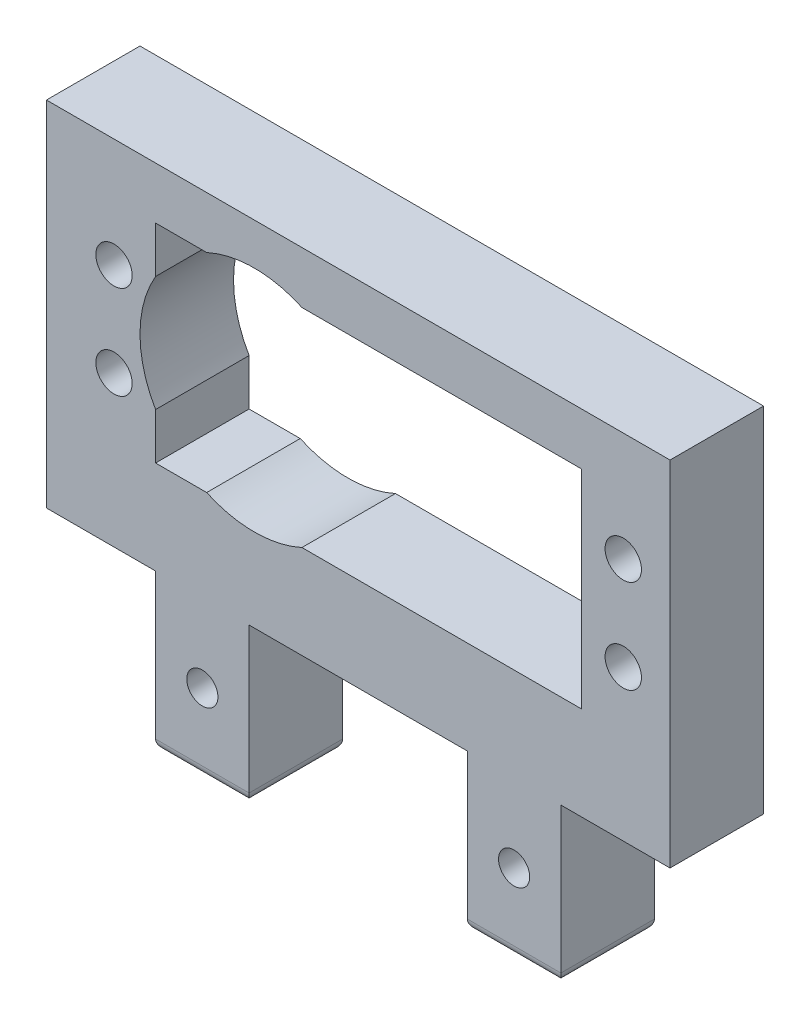
ISO-10303-21;
HEADER;
FILE_DESCRIPTION(('STEP AP214'),'2;1');
FILE_NAME('part.step','',(''),(''),'','','');
FILE_SCHEMA(('AUTOMOTIVE_DESIGN { 1 0 10303 214 1 1 1 1 }'));
ENDSEC;
DATA;
#1=APPLICATION_CONTEXT('core data for automotive mechanical design processes');
#2=APPLICATION_PROTOCOL_DEFINITION('international standard','automotive_design',2000,#1);
#3=PRODUCT_CONTEXT('',#1,'mechanical');
#4=PRODUCT('Part','Part','',(#3));
#5=PRODUCT_RELATED_PRODUCT_CATEGORY('part','',(#4));
#6=PRODUCT_DEFINITION_FORMATION('','',#4);
#7=PRODUCT_DEFINITION_CONTEXT('part definition',#1,'design');
#8=PRODUCT_DEFINITION('design','',#6,#7);
#9=PRODUCT_DEFINITION_SHAPE('','',#8);
#10=(LENGTH_UNIT() NAMED_UNIT(*) SI_UNIT(.MILLI.,.METRE.));
#11=(NAMED_UNIT(*) PLANE_ANGLE_UNIT() SI_UNIT($,.RADIAN.));
#12=(NAMED_UNIT(*) SI_UNIT($,.STERADIAN.) SOLID_ANGLE_UNIT());
#13=UNCERTAINTY_MEASURE_WITH_UNIT(LENGTH_MEASURE(1.E-05),#10,'distance_accuracy_value','');
#14=(GEOMETRIC_REPRESENTATION_CONTEXT(3) GLOBAL_UNCERTAINTY_ASSIGNED_CONTEXT((#13)) GLOBAL_UNIT_ASSIGNED_CONTEXT((#10,
#11,#12)) REPRESENTATION_CONTEXT('',''));
#15=CARTESIAN_POINT('',(0.,0.,0.));
#16=DIRECTION('',(0.,0.,1.));
#17=DIRECTION('',(1.,0.,0.));
#18=AXIS2_PLACEMENT_3D('',#15,#16,#17);
#19=CARTESIAN_POINT('',(0.,0.,9.));
#20=DIRECTION('',(0.,1.,0.));
#21=DIRECTION('',(0.,0.,1.));
#22=AXIS2_PLACEMENT_3D('',#19,#20,#21);
#23=PLANE('',#22);
#24=DIRECTION('',(1.,0.,0.));
#25=VECTOR('',#24,1.);
#26=CARTESIAN_POINT('',(0.,0.,0.));
#27=LINE('',#26,#25);
#28=CARTESIAN_POINT('',(0.,0.,0.));
#29=VERTEX_POINT('',#28);
#30=CARTESIAN_POINT('',(10.5,0.,0.));
#31=VERTEX_POINT('',#30);
#32=EDGE_CURVE('E329',#29,#31,#27,.T.);
#33=ORIENTED_EDGE('',*,*,#32,.T.);
#34=DIRECTION('',(0.,0.,-1.));
#35=VECTOR('',#34,1.);
#36=CARTESIAN_POINT('',(10.5,0.,9.));
#37=LINE('',#36,#35);
#38=CARTESIAN_POINT('',(10.5,0.,9.));
#39=VERTEX_POINT('',#38);
#40=EDGE_CURVE('E370',#39,#31,#37,.T.);
#41=ORIENTED_EDGE('',*,*,#40,.F.);
#42=DIRECTION('',(1.,0.,0.));
#43=VECTOR('',#42,1.);
#44=CARTESIAN_POINT('',(0.,0.,9.));
#45=LINE('',#44,#43);
#46=CARTESIAN_POINT('',(0.,0.,9.));
#47=VERTEX_POINT('',#46);
#48=EDGE_CURVE('E271',#47,#39,#45,.T.);
#49=ORIENTED_EDGE('',*,*,#48,.F.);
#50=DIRECTION('',(0.,0.,-1.));
#51=VECTOR('',#50,1.);
#52=CARTESIAN_POINT('',(0.,0.,9.));
#53=LINE('',#52,#51);
#54=EDGE_CURVE('E218',#47,#29,#53,.T.);
#55=ORIENTED_EDGE('',*,*,#54,.T.);
#56=EDGE_LOOP('',(#33,#41,#49,#55));
#57=FACE_BOUND('',#56,.T.);
#58=ADVANCED_FACE('F35',(#57),#23,.F.);
#59=CARTESIAN_POINT('',(10.5,0.,9.));
#60=DIRECTION('',(-1.,0.,0.));
#61=DIRECTION('',(0.,0.,1.));
#62=AXIS2_PLACEMENT_3D('',#59,#60,#61);
#63=PLANE('',#62);
#64=DIRECTION('',(0.,1.,0.));
#65=VECTOR('',#64,1.);
#66=CARTESIAN_POINT('',(10.5,0.,0.));
#67=LINE('',#66,#65);
#68=CARTESIAN_POINT('',(10.5,-14.,0.));
#69=VERTEX_POINT('',#68);
#70=EDGE_CURVE('E332',#69,#31,#67,.T.);
#71=ORIENTED_EDGE('',*,*,#70,.F.);
#72=DIRECTION('',(0.,0.,-1.));
#73=VECTOR('',#72,1.);
#74=CARTESIAN_POINT('',(10.5,-14.,9.));
#75=LINE('',#74,#73);
#76=CARTESIAN_POINT('',(10.5,-14.,9.));
#77=VERTEX_POINT('',#76);
#78=EDGE_CURVE('E44',#69,#77,#75,.F.);
#79=ORIENTED_EDGE('',*,*,#78,.T.);
#80=DIRECTION('',(0.,1.,0.));
#81=VECTOR('',#80,1.);
#82=CARTESIAN_POINT('',(10.5,0.,9.));
#83=LINE('',#82,#81);
#84=EDGE_CURVE('E274',#77,#39,#83,.T.);
#85=ORIENTED_EDGE('',*,*,#84,.T.);
#86=ORIENTED_EDGE('',*,*,#40,.T.);
#87=EDGE_LOOP('',(#71,#79,#85,#86));
#88=FACE_BOUND('',#87,.T.);
#89=ADVANCED_FACE('F486',(#88),#63,.T.);
#90=CARTESIAN_POINT('',(0.,-15.,9.));
#91=DIRECTION('',(0.,1.,0.));
#92=DIRECTION('',(0.,0.,1.));
#93=AXIS2_PLACEMENT_3D('',#90,#91,#92);
#94=PLANE('',#93);
#95=DIRECTION('',(1.,0.,0.));
#96=VECTOR('',#95,1.);
#97=CARTESIAN_POINT('',(10.5,-15.,8.));
#98=LINE('',#97,#96);
#99=CARTESIAN_POINT('',(18.5,-15.,8.));
#100=VERTEX_POINT('',#99);
#101=CARTESIAN_POINT('',(11.5,-15.,8.));
#102=VERTEX_POINT('',#101);
#103=EDGE_CURVE('E52',#100,#102,#98,.F.);
#104=ORIENTED_EDGE('',*,*,#103,.T.);
#105=DIRECTION('',(0.,0.,-1.));
#106=VECTOR('',#105,1.);
#107=CARTESIAN_POINT('',(11.5,-15.,0.));
#108=LINE('',#107,#106);
#109=CARTESIAN_POINT('',(11.5,-15.,0.999999999999999));
#110=VERTEX_POINT('',#109);
#111=EDGE_CURVE('E415',#102,#110,#108,.T.);
#112=ORIENTED_EDGE('',*,*,#111,.T.);
#113=DIRECTION('',(1.,0.,0.));
#114=VECTOR('',#113,1.);
#115=CARTESIAN_POINT('',(0.,-15.,0.999999999999999));
#116=LINE('',#115,#114);
#117=CARTESIAN_POINT('',(18.5,-15.,0.999999999999999));
#118=VERTEX_POINT('',#117);
#119=EDGE_CURVE('E411',#110,#118,#116,.T.);
#120=ORIENTED_EDGE('',*,*,#119,.T.);
#121=DIRECTION('',(0.,0.,-1.));
#122=VECTOR('',#121,1.);
#123=CARTESIAN_POINT('',(18.5,-15.,9.));
#124=LINE('',#123,#122);
#125=EDGE_CURVE('E57',#118,#100,#124,.F.);
#126=ORIENTED_EDGE('',*,*,#125,.T.);
#127=EDGE_LOOP('',(#104,#112,#120,#126));
#128=FACE_BOUND('',#127,.T.);
#129=ADVANCED_FACE('F493',(#128),#94,.F.);
#130=CARTESIAN_POINT('',(19.5,0.,9.));
#131=DIRECTION('',(-1.,0.,0.));
#132=DIRECTION('',(0.,-1.,0.));
#133=AXIS2_PLACEMENT_3D('',#130,#131,#132);
#134=PLANE('',#133);
#135=DIRECTION('',(0.,1.,0.));
#136=VECTOR('',#135,1.);
#137=CARTESIAN_POINT('',(19.5,0.,9.));
#138=LINE('',#137,#136);
#139=CARTESIAN_POINT('',(19.5,-14.,9.));
#140=VERTEX_POINT('',#139);
#141=CARTESIAN_POINT('',(19.5,0.,9.));
#142=VERTEX_POINT('',#141);
#143=EDGE_CURVE('E278',#140,#142,#138,.T.);
#144=ORIENTED_EDGE('',*,*,#143,.F.);
#145=DIRECTION('',(0.,0.,-1.));
#146=VECTOR('',#145,1.);
#147=CARTESIAN_POINT('',(19.5,-14.,9.));
#148=LINE('',#147,#146);
#149=CARTESIAN_POINT('',(19.5,-14.,0.));
#150=VERTEX_POINT('',#149);
#151=EDGE_CURVE('E11',#140,#150,#148,.T.);
#152=ORIENTED_EDGE('',*,*,#151,.T.);
#153=DIRECTION('',(0.,1.,0.));
#154=VECTOR('',#153,1.);
#155=CARTESIAN_POINT('',(19.5,0.,0.));
#156=LINE('',#155,#154);
#157=CARTESIAN_POINT('',(19.5,0.,0.));
#158=VERTEX_POINT('',#157);
#159=EDGE_CURVE('E336',#150,#158,#156,.T.);
#160=ORIENTED_EDGE('',*,*,#159,.T.);
#161=DIRECTION('',(0.,0.,-1.));
#162=VECTOR('',#161,1.);
#163=CARTESIAN_POINT('',(19.5,0.,9.));
#164=LINE('',#163,#162);
#165=EDGE_CURVE('E367',#142,#158,#164,.T.);
#166=ORIENTED_EDGE('',*,*,#165,.F.);
#167=EDGE_LOOP('',(#144,#152,#160,#166));
#168=FACE_BOUND('',#167,.T.);
#169=ADVANCED_FACE('F446',(#168),#134,.F.);
#170=CARTESIAN_POINT('',(40.5,0.,0.));
#171=VERTEX_POINT('',#170);
#172=EDGE_CURVE('E334',#158,#171,#27,.T.);
#173=ORIENTED_EDGE('',*,*,#172,.T.);
#174=DIRECTION('',(0.,0.,-1.));
#175=VECTOR('',#174,1.);
#176=CARTESIAN_POINT('',(40.5,0.,9.));
#177=LINE('',#176,#175);
#178=CARTESIAN_POINT('',(40.5,0.,9.));
#179=VERTEX_POINT('',#178);
#180=EDGE_CURVE('E364',#179,#171,#177,.T.);
#181=ORIENTED_EDGE('',*,*,#180,.F.);
#182=EDGE_CURVE('E276',#142,#179,#45,.T.);
#183=ORIENTED_EDGE('',*,*,#182,.F.);
#184=ORIENTED_EDGE('',*,*,#165,.T.);
#185=EDGE_LOOP('',(#173,#181,#183,#184));
#186=FACE_BOUND('',#185,.T.);
#187=ADVANCED_FACE('F500',(#186),#23,.F.);
#188=CARTESIAN_POINT('',(40.5,0.,9.));
#189=DIRECTION('',(-1.,0.,0.));
#190=DIRECTION('',(0.,-1.,0.));
#191=AXIS2_PLACEMENT_3D('',#188,#189,#190);
#192=PLANE('',#191);
#193=DIRECTION('',(0.,1.,0.));
#194=VECTOR('',#193,1.);
#195=CARTESIAN_POINT('',(40.5,0.,0.));
#196=LINE('',#195,#194);
#197=CARTESIAN_POINT('',(40.5,-14.,0.));
#198=VERTEX_POINT('',#197);
#199=EDGE_CURVE('E338',#198,#171,#196,.T.);
#200=ORIENTED_EDGE('',*,*,#199,.F.);
#201=DIRECTION('',(0.,0.,-1.));
#202=VECTOR('',#201,1.);
#203=CARTESIAN_POINT('',(40.5,-14.,9.));
#204=LINE('',#203,#202);
#205=CARTESIAN_POINT('',(40.5,-14.,9.));
#206=VERTEX_POINT('',#205);
#207=EDGE_CURVE('E398',#198,#206,#204,.F.);
#208=ORIENTED_EDGE('',*,*,#207,.T.);
#209=DIRECTION('',(0.,1.,0.));
#210=VECTOR('',#209,1.);
#211=CARTESIAN_POINT('',(40.5,0.,9.));
#212=LINE('',#211,#210);
#213=EDGE_CURVE('E280',#206,#179,#212,.T.);
#214=ORIENTED_EDGE('',*,*,#213,.T.);
#215=ORIENTED_EDGE('',*,*,#180,.T.);
#216=EDGE_LOOP('',(#200,#208,#214,#215));
#217=FACE_BOUND('',#216,.T.);
#218=ADVANCED_FACE('F510',(#217),#192,.T.);
#219=CARTESIAN_POINT('',(0.,-15.,9.));
#220=DIRECTION('',(0.,-1.,0.));
#221=DIRECTION('',(1.,0.,0.));
#222=AXIS2_PLACEMENT_3D('',#219,#220,#221);
#223=PLANE('',#222);
#224=DIRECTION('',(-1.,0.,0.));
#225=VECTOR('',#224,1.);
#226=CARTESIAN_POINT('',(0.,-15.,8.));
#227=LINE('',#226,#225);
#228=CARTESIAN_POINT('',(48.5,-15.,8.));
#229=VERTEX_POINT('',#228);
#230=CARTESIAN_POINT('',(41.5,-15.,8.));
#231=VERTEX_POINT('',#230);
#232=EDGE_CURVE('E393',#229,#231,#227,.T.);
#233=ORIENTED_EDGE('',*,*,#232,.T.);
#234=DIRECTION('',(0.,0.,-1.));
#235=VECTOR('',#234,1.);
#236=CARTESIAN_POINT('',(41.5,-15.,9.));
#237=LINE('',#236,#235);
#238=CARTESIAN_POINT('',(41.5,-15.,1.));
#239=VERTEX_POINT('',#238);
#240=EDGE_CURVE('E395',#231,#239,#237,.T.);
#241=ORIENTED_EDGE('',*,*,#240,.T.);
#242=DIRECTION('',(-1.,0.,0.));
#243=VECTOR('',#242,1.);
#244=CARTESIAN_POINT('',(49.5,-15.,1.));
#245=LINE('',#244,#243);
#246=CARTESIAN_POINT('',(48.5,-15.,1.));
#247=VERTEX_POINT('',#246);
#248=EDGE_CURVE('E373',#239,#247,#245,.F.);
#249=ORIENTED_EDGE('',*,*,#248,.T.);
#250=DIRECTION('',(0.,0.,-1.));
#251=VECTOR('',#250,1.);
#252=CARTESIAN_POINT('',(48.5,-15.,9.));
#253=LINE('',#252,#251);
#254=EDGE_CURVE('E391',#247,#229,#253,.F.);
#255=ORIENTED_EDGE('',*,*,#254,.T.);
#256=EDGE_LOOP('',(#233,#241,#249,#255));
#257=FACE_BOUND('',#256,.T.);
#258=ADVANCED_FACE('F517',(#257),#223,.T.);
#259=CARTESIAN_POINT('',(49.5,0.,9.));
#260=DIRECTION('',(-1.,0.,0.));
#261=DIRECTION('',(0.,0.,1.));
#262=AXIS2_PLACEMENT_3D('',#259,#260,#261);
#263=PLANE('',#262);
#264=DIRECTION('',(0.,1.,0.));
#265=VECTOR('',#264,1.);
#266=CARTESIAN_POINT('',(49.5,0.,9.));
#267=LINE('',#266,#265);
#268=CARTESIAN_POINT('',(49.5,-14.,9.));
#269=VERTEX_POINT('',#268);
#270=CARTESIAN_POINT('',(49.5,0.,9.));
#271=VERTEX_POINT('',#270);
#272=EDGE_CURVE('E282',#269,#271,#267,.T.);
#273=ORIENTED_EDGE('',*,*,#272,.F.);
#274=DIRECTION('',(0.,0.,-1.));
#275=VECTOR('',#274,1.);
#276=CARTESIAN_POINT('',(49.5,-14.,0.));
#277=LINE('',#276,#275);
#278=CARTESIAN_POINT('',(49.5,-14.,0.));
#279=VERTEX_POINT('',#278);
#280=EDGE_CURVE('E405',#269,#279,#277,.T.);
#281=ORIENTED_EDGE('',*,*,#280,.T.);
#282=DIRECTION('',(0.,1.,0.));
#283=VECTOR('',#282,1.);
#284=CARTESIAN_POINT('',(49.5,0.,0.));
#285=LINE('',#284,#283);
#286=CARTESIAN_POINT('',(49.5,0.,0.));
#287=VERTEX_POINT('',#286);
#288=EDGE_CURVE('E340',#279,#287,#285,.T.);
#289=ORIENTED_EDGE('',*,*,#288,.T.);
#290=DIRECTION('',(0.,0.,-1.));
#291=VECTOR('',#290,1.);
#292=CARTESIAN_POINT('',(49.5,0.,9.));
#293=LINE('',#292,#291);
#294=EDGE_CURVE('E361',#271,#287,#293,.T.);
#295=ORIENTED_EDGE('',*,*,#294,.F.);
#296=EDGE_LOOP('',(#273,#281,#289,#295));
#297=FACE_BOUND('',#296,.T.);
#298=ADVANCED_FACE('F512',(#297),#263,.F.);
#299=CARTESIAN_POINT('',(60.,0.,0.));
#300=VERTEX_POINT('',#299);
#301=EDGE_CURVE('E333',#287,#300,#27,.T.);
#302=ORIENTED_EDGE('',*,*,#301,.T.);
#303=DIRECTION('',(0.,0.,-1.));
#304=VECTOR('',#303,1.);
#305=CARTESIAN_POINT('',(60.,0.,9.));
#306=LINE('',#305,#304);
#307=CARTESIAN_POINT('',(60.,0.,9.));
#308=VERTEX_POINT('',#307);
#309=EDGE_CURVE('E358',#308,#300,#306,.T.);
#310=ORIENTED_EDGE('',*,*,#309,.F.);
#311=EDGE_CURVE('E275',#271,#308,#45,.T.);
#312=ORIENTED_EDGE('',*,*,#311,.F.);
#313=ORIENTED_EDGE('',*,*,#294,.T.);
#314=EDGE_LOOP('',(#302,#310,#312,#313));
#315=FACE_BOUND('',#314,.T.);
#316=ADVANCED_FACE('F461',(#315),#23,.F.);
#317=CARTESIAN_POINT('',(60.,0.,9.));
#318=DIRECTION('',(-1.,0.,0.));
#319=DIRECTION('',(0.,0.,1.));
#320=AXIS2_PLACEMENT_3D('',#317,#318,#319);
#321=PLANE('',#320);
#322=DIRECTION('',(0.,1.,0.));
#323=VECTOR('',#322,1.);
#324=CARTESIAN_POINT('',(60.,0.,0.));
#325=LINE('',#324,#323);
#326=CARTESIAN_POINT('',(60.,34.,0.));
#327=VERTEX_POINT('',#326);
#328=EDGE_CURVE('E342',#300,#327,#325,.T.);
#329=ORIENTED_EDGE('',*,*,#328,.T.);
#330=DIRECTION('',(0.,0.,-1.));
#331=VECTOR('',#330,1.);
#332=CARTESIAN_POINT('',(60.,34.,9.));
#333=LINE('',#332,#331);
#334=CARTESIAN_POINT('',(60.,34.,9.));
#335=VERTEX_POINT('',#334);
#336=EDGE_CURVE('E356',#335,#327,#333,.T.);
#337=ORIENTED_EDGE('',*,*,#336,.F.);
#338=DIRECTION('',(0.,1.,0.));
#339=VECTOR('',#338,1.);
#340=CARTESIAN_POINT('',(60.,0.,9.));
#341=LINE('',#340,#339);
#342=EDGE_CURVE('E284',#308,#335,#341,.T.);
#343=ORIENTED_EDGE('',*,*,#342,.F.);
#344=ORIENTED_EDGE('',*,*,#309,.T.);
#345=EDGE_LOOP('',(#329,#337,#343,#344));
#346=FACE_BOUND('',#345,.T.);
#347=ADVANCED_FACE('F467',(#346),#321,.F.);
#348=CARTESIAN_POINT('',(0.,34.,9.));
#349=DIRECTION('',(0.,1.,0.));
#350=DIRECTION('',(0.,0.,1.));
#351=AXIS2_PLACEMENT_3D('',#348,#349,#350);
#352=PLANE('',#351);
#353=DIRECTION('',(1.,0.,0.));
#354=VECTOR('',#353,1.);
#355=CARTESIAN_POINT('',(0.,34.,0.));
#356=LINE('',#355,#354);
#357=CARTESIAN_POINT('',(0.,34.,0.));
#358=VERTEX_POINT('',#357);
#359=EDGE_CURVE('E345',#358,#327,#356,.T.);
#360=ORIENTED_EDGE('',*,*,#359,.F.);
#361=DIRECTION('',(0.,0.,-1.));
#362=VECTOR('',#361,1.);
#363=CARTESIAN_POINT('',(0.,34.,9.));
#364=LINE('',#363,#362);
#365=CARTESIAN_POINT('',(0.,34.,9.));
#366=VERTEX_POINT('',#365);
#367=EDGE_CURVE('E354',#366,#358,#364,.T.);
#368=ORIENTED_EDGE('',*,*,#367,.F.);
#369=DIRECTION('',(1.,0.,0.));
#370=VECTOR('',#369,1.);
#371=CARTESIAN_POINT('',(0.,34.,9.));
#372=LINE('',#371,#370);
#373=EDGE_CURVE('E286',#366,#335,#372,.T.);
#374=ORIENTED_EDGE('',*,*,#373,.T.);
#375=ORIENTED_EDGE('',*,*,#336,.T.);
#376=EDGE_LOOP('',(#360,#368,#374,#375));
#377=FACE_BOUND('',#376,.T.);
#378=ADVANCED_FACE('F473',(#377),#352,.T.);
#379=CARTESIAN_POINT('',(20.,19.,9.));
#380=DIRECTION('',(0.,0.,-1.));
#381=DIRECTION('',(-1.,0.,0.));
#382=AXIS2_PLACEMENT_3D('',#379,#380,#381);
#383=CYLINDRICAL_SURFACE('',#382,11.);
#384=CARTESIAN_POINT('',(20.,19.,0.));
#385=DIRECTION('',(0.,0.,1.));
#386=DIRECTION('',(1.,0.,0.));
#387=AXIS2_PLACEMENT_3D('',#384,#385,#386);
#388=CIRCLE('',#387,11.);
#389=CARTESIAN_POINT('',(24.5825756949558,29.,0.));
#390=VERTEX_POINT('',#389);
#391=CARTESIAN_POINT('',(15.4174243050442,29.,0.));
#392=VERTEX_POINT('',#391);
#393=EDGE_CURVE('E215',#390,#392,#388,.T.);
#394=ORIENTED_EDGE('',*,*,#393,.F.);
#395=DIRECTION('',(0.,0.,-1.));
#396=VECTOR('',#395,1.);
#397=CARTESIAN_POINT('',(24.5825756949558,29.,9.));
#398=LINE('',#397,#396);
#399=CARTESIAN_POINT('',(24.5825756949558,29.,9.));
#400=VERTEX_POINT('',#399);
#401=EDGE_CURVE('E209',#400,#390,#398,.T.);
#402=ORIENTED_EDGE('',*,*,#401,.F.);
#403=CARTESIAN_POINT('',(20.,19.,9.));
#404=DIRECTION('',(0.,0.,1.));
#405=DIRECTION('',(1.,0.,0.));
#406=AXIS2_PLACEMENT_3D('',#403,#404,#405);
#407=CIRCLE('',#406,11.);
#408=CARTESIAN_POINT('',(15.4174243050442,29.,9.));
#409=VERTEX_POINT('',#408);
#410=EDGE_CURVE('E213',#400,#409,#407,.T.);
#411=ORIENTED_EDGE('',*,*,#410,.T.);
#412=DIRECTION('',(0.,0.,-1.));
#413=VECTOR('',#412,1.);
#414=CARTESIAN_POINT('',(15.4174243050442,29.,9.));
#415=LINE('',#414,#413);
#416=EDGE_CURVE('E298',#409,#392,#415,.T.);
#417=ORIENTED_EDGE('',*,*,#416,.T.);
#418=EDGE_LOOP('',(#394,#402,#411,#417));
#419=FACE_BOUND('',#418,.T.);
#420=ADVANCED_FACE('F211',(#419),#383,.F.);
#421=CARTESIAN_POINT('',(0.,29.,9.));
#422=DIRECTION('',(0.,1.,0.));
#423=DIRECTION('',(0.,0.,1.));
#424=AXIS2_PLACEMENT_3D('',#421,#422,#423);
#425=PLANE('',#424);
#426=DIRECTION('',(1.,0.,0.));
#427=VECTOR('',#426,1.);
#428=CARTESIAN_POINT('',(0.,29.,0.));
#429=LINE('',#428,#427);
#430=CARTESIAN_POINT('',(51.5,29.,0.));
#431=VERTEX_POINT('',#430);
#432=EDGE_CURVE('E300',#390,#431,#429,.T.);
#433=ORIENTED_EDGE('',*,*,#432,.T.);
#434=DIRECTION('',(0.,0.,-1.));
#435=VECTOR('',#434,1.);
#436=CARTESIAN_POINT('',(51.5,29.,9.));
#437=LINE('',#436,#435);
#438=CARTESIAN_POINT('',(51.5,29.,9.));
#439=VERTEX_POINT('',#438);
#440=EDGE_CURVE('E219',#439,#431,#437,.T.);
#441=ORIENTED_EDGE('',*,*,#440,.F.);
#442=DIRECTION('',(1.,0.,0.));
#443=VECTOR('',#442,1.);
#444=CARTESIAN_POINT('',(0.,29.,9.));
#445=LINE('',#444,#443);
#446=EDGE_CURVE('E222',#400,#439,#445,.T.);
#447=ORIENTED_EDGE('',*,*,#446,.F.);
#448=ORIENTED_EDGE('',*,*,#401,.T.);
#449=EDGE_LOOP('',(#433,#441,#447,#448));
#450=FACE_BOUND('',#449,.T.);
#451=ADVANCED_FACE('F223',(#450),#425,.F.);
#452=CARTESIAN_POINT('',(51.5,0.,9.));
#453=DIRECTION('',(1.,0.,0.));
#454=DIRECTION('',(0.,1.,0.));
#455=AXIS2_PLACEMENT_3D('',#452,#453,#454);
#456=PLANE('',#455);
#457=DIRECTION('',(0.,-1.,0.));
#458=VECTOR('',#457,1.);
#459=CARTESIAN_POINT('',(51.5,0.,0.));
#460=LINE('',#459,#458);
#461=CARTESIAN_POINT('',(51.5,9.,0.));
#462=VERTEX_POINT('',#461);
#463=EDGE_CURVE('E305',#431,#462,#460,.T.);
#464=ORIENTED_EDGE('',*,*,#463,.T.);
#465=DIRECTION('',(0.,0.,-1.));
#466=VECTOR('',#465,1.);
#467=CARTESIAN_POINT('',(51.5,9.,9.));
#468=LINE('',#467,#466);
#469=CARTESIAN_POINT('',(51.5,9.,9.));
#470=VERTEX_POINT('',#469);
#471=EDGE_CURVE('E387',#470,#462,#468,.T.);
#472=ORIENTED_EDGE('',*,*,#471,.F.);
#473=DIRECTION('',(0.,-1.,0.));
#474=VECTOR('',#473,1.);
#475=CARTESIAN_POINT('',(51.5,0.,9.));
#476=LINE('',#475,#474);
#477=EDGE_CURVE('E227',#439,#470,#476,.T.);
#478=ORIENTED_EDGE('',*,*,#477,.F.);
#479=ORIENTED_EDGE('',*,*,#440,.T.);
#480=EDGE_LOOP('',(#464,#472,#478,#479));
#481=FACE_BOUND('',#480,.T.);
#482=ADVANCED_FACE('F577',(#481),#456,.F.);
#483=CARTESIAN_POINT('',(0.,9.,9.));
#484=DIRECTION('',(0.,1.,0.));
#485=DIRECTION('',(0.,0.,1.));
#486=AXIS2_PLACEMENT_3D('',#483,#484,#485);
#487=PLANE('',#486);
#488=DIRECTION('',(1.,0.,0.));
#489=VECTOR('',#488,1.);
#490=CARTESIAN_POINT('',(0.,9.,0.));
#491=LINE('',#490,#489);
#492=CARTESIAN_POINT('',(24.5825756949558,9.,0.));
#493=VERTEX_POINT('',#492);
#494=EDGE_CURVE('E309',#493,#462,#491,.T.);
#495=ORIENTED_EDGE('',*,*,#494,.F.);
#496=DIRECTION('',(0.,0.,-1.));
#497=VECTOR('',#496,1.);
#498=CARTESIAN_POINT('',(24.5825756949558,9.,9.));
#499=LINE('',#498,#497);
#500=CARTESIAN_POINT('',(24.5825756949558,9.,9.));
#501=VERTEX_POINT('',#500);
#502=EDGE_CURVE('E385',#501,#493,#499,.T.);
#503=ORIENTED_EDGE('',*,*,#502,.F.);
#504=DIRECTION('',(1.,0.,0.));
#505=VECTOR('',#504,1.);
#506=CARTESIAN_POINT('',(0.,9.,9.));
#507=LINE('',#506,#505);
#508=EDGE_CURVE('E247',#501,#470,#507,.T.);
#509=ORIENTED_EDGE('',*,*,#508,.T.);
#510=ORIENTED_EDGE('',*,*,#471,.T.);
#511=EDGE_LOOP('',(#495,#503,#509,#510));
#512=FACE_BOUND('',#511,.T.);
#513=ADVANCED_FACE('F580',(#512),#487,.T.);
#514=CARTESIAN_POINT('',(15.4174243050442,9.,0.));
#515=VERTEX_POINT('',#514);
#516=EDGE_CURVE('E303',#515,#493,#388,.T.);
#517=ORIENTED_EDGE('',*,*,#516,.F.);
#518=DIRECTION('',(0.,0.,-1.));
#519=VECTOR('',#518,1.);
#520=CARTESIAN_POINT('',(15.4174243050442,9.,9.));
#521=LINE('',#520,#519);
#522=CARTESIAN_POINT('',(15.4174243050442,9.,9.));
#523=VERTEX_POINT('',#522);
#524=EDGE_CURVE('E383',#523,#515,#521,.T.);
#525=ORIENTED_EDGE('',*,*,#524,.F.);
#526=EDGE_CURVE('E238',#523,#501,#407,.T.);
#527=ORIENTED_EDGE('',*,*,#526,.T.);
#528=ORIENTED_EDGE('',*,*,#502,.T.);
#529=EDGE_LOOP('',(#517,#525,#527,#528));
#530=FACE_BOUND('',#529,.T.);
#531=ADVANCED_FACE('F586',(#530),#383,.F.);
#532=CARTESIAN_POINT('',(10.5,9.,0.));
#533=VERTEX_POINT('',#532);
#534=EDGE_CURVE('E312',#533,#515,#491,.T.);
#535=ORIENTED_EDGE('',*,*,#534,.F.);
#536=DIRECTION('',(0.,0.,-1.));
#537=VECTOR('',#536,1.);
#538=CARTESIAN_POINT('',(10.5,9.,9.));
#539=LINE('',#538,#537);
#540=CARTESIAN_POINT('',(10.5,9.,9.));
#541=VERTEX_POINT('',#540);
#542=EDGE_CURVE('E381',#541,#533,#539,.T.);
#543=ORIENTED_EDGE('',*,*,#542,.F.);
#544=EDGE_CURVE('E246',#541,#523,#507,.T.);
#545=ORIENTED_EDGE('',*,*,#544,.T.);
#546=ORIENTED_EDGE('',*,*,#524,.T.);
#547=EDGE_LOOP('',(#535,#543,#545,#546));
#548=FACE_BOUND('',#547,.T.);
#549=ADVANCED_FACE('F582',(#548),#487,.T.);
#550=CARTESIAN_POINT('',(10.5,0.,9.));
#551=DIRECTION('',(1.,0.,0.));
#552=DIRECTION('',(0.,1.,0.));
#553=AXIS2_PLACEMENT_3D('',#550,#551,#552);
#554=PLANE('',#553);
#555=DIRECTION('',(0.,-1.,0.));
#556=VECTOR('',#555,1.);
#557=CARTESIAN_POINT('',(10.5,0.,0.));
#558=LINE('',#557,#556);
#559=CARTESIAN_POINT('',(10.5,13.4547317467953,0.));
#560=VERTEX_POINT('',#559);
#561=EDGE_CURVE('E313',#560,#533,#558,.T.);
#562=ORIENTED_EDGE('',*,*,#561,.F.);
#563=DIRECTION('',(0.,0.,-1.));
#564=VECTOR('',#563,1.);
#565=CARTESIAN_POINT('',(10.5,13.4547317467953,9.));
#566=LINE('',#565,#564);
#567=CARTESIAN_POINT('',(10.5,13.4547317467953,9.));
#568=VERTEX_POINT('',#567);
#569=EDGE_CURVE('E379',#568,#560,#566,.T.);
#570=ORIENTED_EDGE('',*,*,#569,.F.);
#571=DIRECTION('',(0.,-1.,0.));
#572=VECTOR('',#571,1.);
#573=CARTESIAN_POINT('',(10.5,0.,9.));
#574=LINE('',#573,#572);
#575=EDGE_CURVE('E244',#568,#541,#574,.T.);
#576=ORIENTED_EDGE('',*,*,#575,.T.);
#577=ORIENTED_EDGE('',*,*,#542,.T.);
#578=EDGE_LOOP('',(#562,#570,#576,#577));
#579=FACE_BOUND('',#578,.T.);
#580=ADVANCED_FACE('F585',(#579),#554,.T.);
#581=CARTESIAN_POINT('',(10.5,24.5452682532047,0.));
#582=VERTEX_POINT('',#581);
#583=EDGE_CURVE('E302',#582,#560,#388,.T.);
#584=ORIENTED_EDGE('',*,*,#583,.F.);
#585=DIRECTION('',(0.,0.,-1.));
#586=VECTOR('',#585,1.);
#587=CARTESIAN_POINT('',(10.5,24.5452682532047,9.));
#588=LINE('',#587,#586);
#589=CARTESIAN_POINT('',(10.5,24.5452682532047,9.));
#590=VERTEX_POINT('',#589);
#591=EDGE_CURVE('E377',#590,#582,#588,.T.);
#592=ORIENTED_EDGE('',*,*,#591,.F.);
#593=EDGE_CURVE('E237',#590,#568,#407,.T.);
#594=ORIENTED_EDGE('',*,*,#593,.T.);
#595=ORIENTED_EDGE('',*,*,#569,.T.);
#596=EDGE_LOOP('',(#584,#592,#594,#595));
#597=FACE_BOUND('',#596,.T.);
#598=ADVANCED_FACE('F588',(#597),#383,.F.);
#599=CARTESIAN_POINT('',(10.5,29.,0.));
#600=VERTEX_POINT('',#599);
#601=EDGE_CURVE('E316',#600,#582,#558,.T.);
#602=ORIENTED_EDGE('',*,*,#601,.F.);
#603=DIRECTION('',(0.,0.,-1.));
#604=VECTOR('',#603,1.);
#605=CARTESIAN_POINT('',(10.5,29.,9.));
#606=LINE('',#605,#604);
#607=CARTESIAN_POINT('',(10.5,29.,9.));
#608=VERTEX_POINT('',#607);
#609=EDGE_CURVE('E375',#608,#600,#606,.T.);
#610=ORIENTED_EDGE('',*,*,#609,.F.);
#611=EDGE_CURVE('E243',#608,#590,#574,.T.);
#612=ORIENTED_EDGE('',*,*,#611,.T.);
#613=ORIENTED_EDGE('',*,*,#591,.T.);
#614=EDGE_LOOP('',(#602,#610,#612,#613));
#615=FACE_BOUND('',#614,.T.);
#616=ADVANCED_FACE('F591',(#615),#554,.T.);
#617=CARTESIAN_POINT('',(45.,-7.5,9.));
#618=DIRECTION('',(0.,0.,-1.));
#619=DIRECTION('',(-1.,0.,0.));
#620=AXIS2_PLACEMENT_3D('',#617,#618,#619);
#621=CYLINDRICAL_SURFACE('',#620,1.5);
#622=CARTESIAN_POINT('',(45.,-7.5,9.));
#623=DIRECTION('',(0.,0.,1.));
#624=DIRECTION('',(1.,0.,0.));
#625=AXIS2_PLACEMENT_3D('',#622,#623,#624);
#626=CIRCLE('',#625,1.5);
#627=CARTESIAN_POINT('',(46.5,-7.5,9.));
#628=VERTEX_POINT('',#627);
#629=EDGE_CURVE('E292',#628,#628,#626,.T.);
#630=ORIENTED_EDGE('',*,*,#629,.T.);
#631=EDGE_LOOP('',(#630));
#632=FACE_BOUND('',#631,.T.);
#633=CARTESIAN_POINT('',(45.,-7.5,0.));
#634=DIRECTION('',(0.,0.,1.));
#635=DIRECTION('',(1.,0.,0.));
#636=AXIS2_PLACEMENT_3D('',#633,#634,#635);
#637=CIRCLE('',#636,1.5);
#638=CARTESIAN_POINT('',(46.5,-7.5,0.));
#639=VERTEX_POINT('',#638);
#640=EDGE_CURVE('E240',#639,#639,#637,.T.);
#641=ORIENTED_EDGE('',*,*,#640,.F.);
#642=EDGE_LOOP('',(#641));
#643=FACE_BOUND('',#642,.T.);
#644=ADVANCED_FACE('F595',(#632,#643),#621,.F.);
#645=CARTESIAN_POINT('',(0.,0.,9.));
#646=DIRECTION('',(-1.,0.,0.));
#647=DIRECTION('',(0.,0.,1.));
#648=AXIS2_PLACEMENT_3D('',#645,#646,#647);
#649=PLANE('',#648);
#650=DIRECTION('',(0.,1.,0.));
#651=VECTOR('',#650,1.);
#652=CARTESIAN_POINT('',(0.,0.,0.));
#653=LINE('',#652,#651);
#654=EDGE_CURVE('E348',#29,#358,#653,.T.);
#655=ORIENTED_EDGE('',*,*,#654,.F.);
#656=ORIENTED_EDGE('',*,*,#54,.F.);
#657=DIRECTION('',(0.,1.,0.));
#658=VECTOR('',#657,1.);
#659=CARTESIAN_POINT('',(0.,0.,9.));
#660=LINE('',#659,#658);
#661=EDGE_CURVE('E289',#47,#366,#660,.T.);
#662=ORIENTED_EDGE('',*,*,#661,.T.);
#663=ORIENTED_EDGE('',*,*,#367,.T.);
#664=EDGE_LOOP('',(#655,#656,#662,#663));
#665=FACE_BOUND('',#664,.T.);
#666=ADVANCED_FACE('F480',(#665),#649,.T.);
#667=CARTESIAN_POINT('',(6.5,23.5,9.));
#668=DIRECTION('',(0.,0.,-1.));
#669=DIRECTION('',(-1.,0.,0.));
#670=AXIS2_PLACEMENT_3D('',#667,#668,#669);
#671=CYLINDRICAL_SURFACE('',#670,1.75);
#672=CARTESIAN_POINT('',(6.5,23.5,9.));
#673=DIRECTION('',(0.,0.,1.));
#674=DIRECTION('',(1.,0.,0.));
#675=AXIS2_PLACEMENT_3D('',#672,#673,#674);
#676=CIRCLE('',#675,1.75);
#677=CARTESIAN_POINT('',(8.25,23.5,9.));
#678=VERTEX_POINT('',#677);
#679=EDGE_CURVE('E268',#678,#678,#676,.T.);
#680=ORIENTED_EDGE('',*,*,#679,.T.);
#681=EDGE_LOOP('',(#680));
#682=FACE_BOUND('',#681,.T.);
#683=CARTESIAN_POINT('',(6.5,23.5,0.));
#684=DIRECTION('',(0.,0.,1.));
#685=DIRECTION('',(1.,0.,0.));
#686=AXIS2_PLACEMENT_3D('',#683,#684,#685);
#687=CIRCLE('',#686,1.75);
#688=CARTESIAN_POINT('',(8.25,23.5,0.));
#689=VERTEX_POINT('',#688);
#690=EDGE_CURVE('E326',#689,#689,#687,.T.);
#691=ORIENTED_EDGE('',*,*,#690,.F.);
#692=EDGE_LOOP('',(#691));
#693=FACE_BOUND('',#692,.T.);
#694=ADVANCED_FACE('F613',(#682,#693),#671,.F.);
#695=CARTESIAN_POINT('',(6.5,14.5,9.));
#696=DIRECTION('',(0.,0.,-1.));
#697=DIRECTION('',(-1.,0.,0.));
#698=AXIS2_PLACEMENT_3D('',#695,#696,#697);
#699=CYLINDRICAL_SURFACE('',#698,1.75);
#700=CARTESIAN_POINT('',(6.5,14.5,9.));
#701=DIRECTION('',(0.,0.,1.));
#702=DIRECTION('',(1.,0.,0.));
#703=AXIS2_PLACEMENT_3D('',#700,#701,#702);
#704=CIRCLE('',#703,1.75);
#705=CARTESIAN_POINT('',(8.25,14.5,9.));
#706=VERTEX_POINT('',#705);
#707=EDGE_CURVE('E265',#706,#706,#704,.T.);
#708=ORIENTED_EDGE('',*,*,#707,.T.);
#709=EDGE_LOOP('',(#708));
#710=FACE_BOUND('',#709,.T.);
#711=CARTESIAN_POINT('',(6.5,14.5,0.));
#712=DIRECTION('',(0.,0.,1.));
#713=DIRECTION('',(1.,0.,0.));
#714=AXIS2_PLACEMENT_3D('',#711,#712,#713);
#715=CIRCLE('',#714,1.75);
#716=CARTESIAN_POINT('',(8.25,14.5,0.));
#717=VERTEX_POINT('',#716);
#718=EDGE_CURVE('E323',#717,#717,#715,.T.);
#719=ORIENTED_EDGE('',*,*,#718,.F.);
#720=EDGE_LOOP('',(#719));
#721=FACE_BOUND('',#720,.T.);
#722=ADVANCED_FACE('F609',(#710,#721),#699,.F.);
#723=CARTESIAN_POINT('',(55.5,23.5,9.));
#724=DIRECTION('',(0.,0.,-1.));
#725=DIRECTION('',(-1.,0.,0.));
#726=AXIS2_PLACEMENT_3D('',#723,#724,#725);
#727=CYLINDRICAL_SURFACE('',#726,1.75);
#728=CARTESIAN_POINT('',(55.5,23.5,9.));
#729=DIRECTION('',(0.,0.,1.));
#730=DIRECTION('',(1.,0.,0.));
#731=AXIS2_PLACEMENT_3D('',#728,#729,#730);
#732=CIRCLE('',#731,1.75);
#733=CARTESIAN_POINT('',(57.25,23.5,9.));
#734=VERTEX_POINT('',#733);
#735=EDGE_CURVE('E262',#734,#734,#732,.T.);
#736=ORIENTED_EDGE('',*,*,#735,.T.);
#737=EDGE_LOOP('',(#736));
#738=FACE_BOUND('',#737,.T.);
#739=CARTESIAN_POINT('',(55.5,23.5,0.));
#740=DIRECTION('',(0.,0.,1.));
#741=DIRECTION('',(1.,0.,0.));
#742=AXIS2_PLACEMENT_3D('',#739,#740,#741);
#743=CIRCLE('',#742,1.75);
#744=CARTESIAN_POINT('',(57.25,23.5,0.));
#745=VERTEX_POINT('',#744);
#746=EDGE_CURVE('E320',#745,#745,#743,.T.);
#747=ORIENTED_EDGE('',*,*,#746,.F.);
#748=EDGE_LOOP('',(#747));
#749=FACE_BOUND('',#748,.T.);
#750=ADVANCED_FACE('F605',(#738,#749),#727,.F.);
#751=CARTESIAN_POINT('',(55.5,14.5,9.));
#752=DIRECTION('',(0.,0.,-1.));
#753=DIRECTION('',(-1.,0.,0.));
#754=AXIS2_PLACEMENT_3D('',#751,#752,#753);
#755=CYLINDRICAL_SURFACE('',#754,1.75);
#756=CARTESIAN_POINT('',(55.5,14.5,9.));
#757=DIRECTION('',(0.,0.,1.));
#758=DIRECTION('',(1.,0.,0.));
#759=AXIS2_PLACEMENT_3D('',#756,#757,#758);
#760=CIRCLE('',#759,1.75);
#761=CARTESIAN_POINT('',(57.25,14.5,9.));
#762=VERTEX_POINT('',#761);
#763=EDGE_CURVE('E259',#762,#762,#760,.T.);
#764=ORIENTED_EDGE('',*,*,#763,.T.);
#765=EDGE_LOOP('',(#764));
#766=FACE_BOUND('',#765,.T.);
#767=CARTESIAN_POINT('',(55.5,14.5,0.));
#768=DIRECTION('',(0.,0.,1.));
#769=DIRECTION('',(1.,0.,0.));
#770=AXIS2_PLACEMENT_3D('',#767,#768,#769);
#771=CIRCLE('',#770,1.75);
#772=CARTESIAN_POINT('',(57.25,14.5,0.));
#773=VERTEX_POINT('',#772);
#774=EDGE_CURVE('E317',#773,#773,#771,.T.);
#775=ORIENTED_EDGE('',*,*,#774,.F.);
#776=EDGE_LOOP('',(#775));
#777=FACE_BOUND('',#776,.T.);
#778=ADVANCED_FACE('F601',(#766,#777),#755,.F.);
#779=EDGE_CURVE('E306',#600,#392,#429,.T.);
#780=ORIENTED_EDGE('',*,*,#779,.T.);
#781=ORIENTED_EDGE('',*,*,#416,.F.);
#782=EDGE_CURVE('E229',#608,#409,#445,.T.);
#783=ORIENTED_EDGE('',*,*,#782,.F.);
#784=ORIENTED_EDGE('',*,*,#609,.T.);
#785=EDGE_LOOP('',(#780,#781,#783,#784));
#786=FACE_BOUND('',#785,.T.);
#787=ADVANCED_FACE('F597',(#786),#425,.F.);
#788=CARTESIAN_POINT('',(15.,-7.5,9.));
#789=DIRECTION('',(0.,0.,-1.));
#790=DIRECTION('',(-1.,0.,0.));
#791=AXIS2_PLACEMENT_3D('',#788,#789,#790);
#792=CYLINDRICAL_SURFACE('',#791,1.5);
#793=CARTESIAN_POINT('',(15.,-7.5,9.));
#794=DIRECTION('',(0.,0.,1.));
#795=DIRECTION('',(1.,0.,0.));
#796=AXIS2_PLACEMENT_3D('',#793,#794,#795);
#797=CIRCLE('',#796,1.5);
#798=CARTESIAN_POINT('',(16.5,-7.5,9.));
#799=VERTEX_POINT('',#798);
#800=EDGE_CURVE('E295',#799,#799,#797,.T.);
#801=ORIENTED_EDGE('',*,*,#800,.T.);
#802=EDGE_LOOP('',(#801));
#803=FACE_BOUND('',#802,.T.);
#804=CARTESIAN_POINT('',(15.,-7.5,0.));
#805=DIRECTION('',(0.,0.,1.));
#806=DIRECTION('',(1.,0.,0.));
#807=AXIS2_PLACEMENT_3D('',#804,#805,#806);
#808=CIRCLE('',#807,1.5);
#809=CARTESIAN_POINT('',(16.5,-7.5,0.));
#810=VERTEX_POINT('',#809);
#811=EDGE_CURVE('E235',#810,#810,#808,.T.);
#812=ORIENTED_EDGE('',*,*,#811,.F.);
#813=EDGE_LOOP('',(#812));
#814=FACE_BOUND('',#813,.T.);
#815=ADVANCED_FACE('F600',(#803,#814),#792,.F.);
#816=CARTESIAN_POINT('',(0.,0.,9.));
#817=DIRECTION('',(0.,0.,1.));
#818=DIRECTION('',(1.,0.,0.));
#819=AXIS2_PLACEMENT_3D('',#816,#817,#818);
#820=PLANE('',#819);
#821=ORIENTED_EDGE('',*,*,#410,.F.);
#822=ORIENTED_EDGE('',*,*,#446,.T.);
#823=ORIENTED_EDGE('',*,*,#477,.T.);
#824=ORIENTED_EDGE('',*,*,#508,.F.);
#825=ORIENTED_EDGE('',*,*,#526,.F.);
#826=ORIENTED_EDGE('',*,*,#544,.F.);
#827=ORIENTED_EDGE('',*,*,#575,.F.);
#828=ORIENTED_EDGE('',*,*,#593,.F.);
#829=ORIENTED_EDGE('',*,*,#611,.F.);
#830=ORIENTED_EDGE('',*,*,#782,.T.);
#831=EDGE_LOOP('',(#821,#822,#823,#824,#825,#826,#827,#828,#829,#830));
#832=FACE_BOUND('',#831,.T.);
#833=ORIENTED_EDGE('',*,*,#763,.F.);
#834=EDGE_LOOP('',(#833));
#835=FACE_BOUND('',#834,.T.);
#836=ORIENTED_EDGE('',*,*,#735,.F.);
#837=EDGE_LOOP('',(#836));
#838=FACE_BOUND('',#837,.T.);
#839=ORIENTED_EDGE('',*,*,#707,.F.);
#840=EDGE_LOOP('',(#839));
#841=FACE_BOUND('',#840,.T.);
#842=ORIENTED_EDGE('',*,*,#679,.F.);
#843=EDGE_LOOP('',(#842));
#844=FACE_BOUND('',#843,.T.);
#845=ORIENTED_EDGE('',*,*,#213,.F.);
#846=DIRECTION('',(-1.,0.,0.));
#847=VECTOR('',#846,1.);
#848=CARTESIAN_POINT('',(0.,-14.,9.));
#849=LINE('',#848,#847);
#850=EDGE_CURVE('E403',#206,#269,#849,.F.);
#851=ORIENTED_EDGE('',*,*,#850,.T.);
#852=ORIENTED_EDGE('',*,*,#272,.T.);
#853=ORIENTED_EDGE('',*,*,#311,.T.);
#854=ORIENTED_EDGE('',*,*,#342,.T.);
#855=ORIENTED_EDGE('',*,*,#373,.F.);
#856=ORIENTED_EDGE('',*,*,#661,.F.);
#857=ORIENTED_EDGE('',*,*,#48,.T.);
#858=ORIENTED_EDGE('',*,*,#84,.F.);
#859=DIRECTION('',(1.,0.,0.));
#860=VECTOR('',#859,1.);
#861=CARTESIAN_POINT('',(19.5,-14.,9.));
#862=LINE('',#861,#860);
#863=EDGE_CURVE('E401',#77,#140,#862,.T.);
#864=ORIENTED_EDGE('',*,*,#863,.T.);
#865=ORIENTED_EDGE('',*,*,#143,.T.);
#866=ORIENTED_EDGE('',*,*,#182,.T.);
#867=EDGE_LOOP('',(#845,#851,#852,#853,#854,#855,#856,#857,#858,#864,#865,#866));
#868=FACE_BOUND('',#867,.T.);
#869=ORIENTED_EDGE('',*,*,#629,.F.);
#870=EDGE_LOOP('',(#869));
#871=FACE_BOUND('',#870,.T.);
#872=ORIENTED_EDGE('',*,*,#800,.F.);
#873=EDGE_LOOP('',(#872));
#874=FACE_BOUND('',#873,.T.);
#875=ADVANCED_FACE('F230',(#832,#835,#838,#841,#844,#868,#871,#874),#820,.T.);
#876=CARTESIAN_POINT('',(0.,0.,0.));
#877=DIRECTION('',(0.,0.,1.));
#878=DIRECTION('',(1.,0.,0.));
#879=AXIS2_PLACEMENT_3D('',#876,#877,#878);
#880=PLANE('',#879);
#881=ORIENTED_EDGE('',*,*,#393,.T.);
#882=ORIENTED_EDGE('',*,*,#779,.F.);
#883=ORIENTED_EDGE('',*,*,#601,.T.);
#884=ORIENTED_EDGE('',*,*,#583,.T.);
#885=ORIENTED_EDGE('',*,*,#561,.T.);
#886=ORIENTED_EDGE('',*,*,#534,.T.);
#887=ORIENTED_EDGE('',*,*,#516,.T.);
#888=ORIENTED_EDGE('',*,*,#494,.T.);
#889=ORIENTED_EDGE('',*,*,#463,.F.);
#890=ORIENTED_EDGE('',*,*,#432,.F.);
#891=EDGE_LOOP('',(#881,#882,#883,#884,#885,#886,#887,#888,#889,#890));
#892=FACE_BOUND('',#891,.T.);
#893=ORIENTED_EDGE('',*,*,#774,.T.);
#894=EDGE_LOOP('',(#893));
#895=FACE_BOUND('',#894,.T.);
#896=ORIENTED_EDGE('',*,*,#746,.T.);
#897=EDGE_LOOP('',(#896));
#898=FACE_BOUND('',#897,.T.);
#899=ORIENTED_EDGE('',*,*,#718,.T.);
#900=EDGE_LOOP('',(#899));
#901=FACE_BOUND('',#900,.T.);
#902=ORIENTED_EDGE('',*,*,#690,.T.);
#903=EDGE_LOOP('',(#902));
#904=FACE_BOUND('',#903,.T.);
#905=ORIENTED_EDGE('',*,*,#288,.F.);
#906=DIRECTION('',(-1.,0.,0.));
#907=VECTOR('',#906,1.);
#908=CARTESIAN_POINT('',(40.5,-14.,0.));
#909=LINE('',#908,#907);
#910=EDGE_CURVE('E409',#279,#198,#909,.T.);
#911=ORIENTED_EDGE('',*,*,#910,.T.);
#912=ORIENTED_EDGE('',*,*,#199,.T.);
#913=ORIENTED_EDGE('',*,*,#172,.F.);
#914=ORIENTED_EDGE('',*,*,#159,.F.);
#915=DIRECTION('',(1.,0.,0.));
#916=VECTOR('',#915,1.);
#917=CARTESIAN_POINT('',(0.,-14.,0.));
#918=LINE('',#917,#916);
#919=EDGE_CURVE('E407',#150,#69,#918,.F.);
#920=ORIENTED_EDGE('',*,*,#919,.T.);
#921=ORIENTED_EDGE('',*,*,#70,.T.);
#922=ORIENTED_EDGE('',*,*,#32,.F.);
#923=ORIENTED_EDGE('',*,*,#654,.T.);
#924=ORIENTED_EDGE('',*,*,#359,.T.);
#925=ORIENTED_EDGE('',*,*,#328,.F.);
#926=ORIENTED_EDGE('',*,*,#301,.F.);
#927=EDGE_LOOP('',(#905,#911,#912,#913,#914,#920,#921,#922,#923,#924,#925,#926));
#928=FACE_BOUND('',#927,.T.);
#929=ORIENTED_EDGE('',*,*,#640,.T.);
#930=EDGE_LOOP('',(#929));
#931=FACE_BOUND('',#930,.T.);
#932=ORIENTED_EDGE('',*,*,#811,.T.);
#933=EDGE_LOOP('',(#932));
#934=FACE_BOUND('',#933,.T.);
#935=ADVANCED_FACE('F451',(#892,#895,#898,#901,#904,#928,#931,#934),#880,.F.);
#936=CARTESIAN_POINT('',(48.5,-14.,9.));
#937=DIRECTION('',(0.,0.,1.));
#938=DIRECTION('',(1.,0.,0.));
#939=AXIS2_PLACEMENT_3D('',#936,#937,#938);
#940=CYLINDRICAL_SURFACE('',#939,1.);
#941=CARTESIAN_POINT('',(48.5,-14.,1.));
#942=DIRECTION('',(0.707106781186547,0.,0.707106781186547));
#943=DIRECTION('',(0.707106781186547,0.,-0.707106781186547));
#944=AXIS2_PLACEMENT_3D('',#941,#942,#943);
#945=ELLIPSE('',#944,1.41421356237309,1.);
#946=EDGE_CURVE('E423',#279,#247,#945,.F.);
#947=ORIENTED_EDGE('',*,*,#946,.F.);
#948=ORIENTED_EDGE('',*,*,#280,.F.);
#949=CARTESIAN_POINT('',(48.5,-14.,8.));
#950=DIRECTION('',(-0.707106781186547,0.,0.707106781186547));
#951=DIRECTION('',(0.707106781186547,0.,0.707106781186547));
#952=AXIS2_PLACEMENT_3D('',#949,#950,#951);
#953=ELLIPSE('',#952,1.41421356237309,1.);
#954=EDGE_CURVE('E301',#229,#269,#953,.T.);
#955=ORIENTED_EDGE('',*,*,#954,.F.);
#956=ORIENTED_EDGE('',*,*,#254,.F.);
#957=EDGE_LOOP('',(#947,#948,#955,#956));
#958=FACE_BOUND('',#957,.T.);
#959=ADVANCED_FACE('F550',(#958),#940,.T.);
#960=CARTESIAN_POINT('',(0.,-14.,8.));
#961=DIRECTION('',(-1.,0.,0.));
#962=DIRECTION('',(0.,-1.,0.));
#963=AXIS2_PLACEMENT_3D('',#960,#961,#962);
#964=CYLINDRICAL_SURFACE('',#963,1.);
#965=ORIENTED_EDGE('',*,*,#954,.T.);
#966=ORIENTED_EDGE('',*,*,#850,.F.);
#967=CARTESIAN_POINT('',(41.5,-14.,8.));
#968=DIRECTION('',(-0.707106781186547,0.,-0.707106781186547));
#969=DIRECTION('',(-0.707106781186547,0.,0.707106781186547));
#970=AXIS2_PLACEMENT_3D('',#967,#968,#969);
#971=ELLIPSE('',#970,1.41421356237309,1.);
#972=EDGE_CURVE('E421',#231,#206,#971,.T.);
#973=ORIENTED_EDGE('',*,*,#972,.F.);
#974=ORIENTED_EDGE('',*,*,#232,.F.);
#975=EDGE_LOOP('',(#965,#966,#973,#974));
#976=FACE_BOUND('',#975,.T.);
#977=ADVANCED_FACE('F546',(#976),#964,.T.);
#978=CARTESIAN_POINT('',(0.,-14.,1.));
#979=DIRECTION('',(1.,0.,0.));
#980=DIRECTION('',(0.,1.,0.));
#981=AXIS2_PLACEMENT_3D('',#978,#979,#980);
#982=CYLINDRICAL_SURFACE('',#981,1.);
#983=ORIENTED_EDGE('',*,*,#946,.T.);
#984=ORIENTED_EDGE('',*,*,#248,.F.);
#985=CARTESIAN_POINT('',(41.5,-14.,1.));
#986=DIRECTION('',(0.707106781186547,0.,-0.707106781186547));
#987=DIRECTION('',(0.707106781186547,0.,0.707106781186547));
#988=AXIS2_PLACEMENT_3D('',#985,#986,#987);
#989=ELLIPSE('',#988,1.41421356237309,1.);
#990=EDGE_CURVE('E419',#198,#239,#989,.F.);
#991=ORIENTED_EDGE('',*,*,#990,.F.);
#992=ORIENTED_EDGE('',*,*,#910,.F.);
#993=EDGE_LOOP('',(#983,#984,#991,#992));
#994=FACE_BOUND('',#993,.T.);
#995=ADVANCED_FACE('F540',(#994),#982,.T.);
#996=CARTESIAN_POINT('',(41.5,-14.,9.));
#997=DIRECTION('',(0.,0.,-1.));
#998=DIRECTION('',(-1.,0.,0.));
#999=AXIS2_PLACEMENT_3D('',#996,#997,#998);
#1000=CYLINDRICAL_SURFACE('',#999,1.);
#1001=ORIENTED_EDGE('',*,*,#972,.T.);
#1002=ORIENTED_EDGE('',*,*,#207,.F.);
#1003=ORIENTED_EDGE('',*,*,#990,.T.);
#1004=ORIENTED_EDGE('',*,*,#240,.F.);
#1005=EDGE_LOOP('',(#1001,#1002,#1003,#1004));
#1006=FACE_BOUND('',#1005,.T.);
#1007=ADVANCED_FACE('F533',(#1006),#1000,.T.);
#1008=CARTESIAN_POINT('',(18.5,-14.,9.));
#1009=DIRECTION('',(0.,0.,-1.));
#1010=DIRECTION('',(-1.,0.,0.));
#1011=AXIS2_PLACEMENT_3D('',#1008,#1009,#1010);
#1012=CYLINDRICAL_SURFACE('',#1011,1.);
#1013=CARTESIAN_POINT('',(18.5,-14.,0.999999999999999));
#1014=DIRECTION('',(0.707106781186547,0.,0.707106781186547));
#1015=DIRECTION('',(0.707106781186547,0.,-0.707106781186547));
#1016=AXIS2_PLACEMENT_3D('',#1013,#1014,#1015);
#1017=ELLIPSE('',#1016,1.41421356237309,1.);
#1018=EDGE_CURVE('E431',#150,#118,#1017,.F.);
#1019=ORIENTED_EDGE('',*,*,#1018,.F.);
#1020=ORIENTED_EDGE('',*,*,#151,.F.);
#1021=CARTESIAN_POINT('',(18.5,-14.,8.));
#1022=DIRECTION('',(0.707106781186547,0.,-0.707106781186547));
#1023=DIRECTION('',(-0.707106781186547,0.,-0.707106781186547));
#1024=AXIS2_PLACEMENT_3D('',#1021,#1022,#1023);
#1025=ELLIPSE('',#1024,1.41421356237309,1.);
#1026=EDGE_CURVE('E39',#100,#140,#1025,.F.);
#1027=ORIENTED_EDGE('',*,*,#1026,.F.);
#1028=ORIENTED_EDGE('',*,*,#125,.F.);
#1029=EDGE_LOOP('',(#1019,#1020,#1027,#1028));
#1030=FACE_BOUND('',#1029,.T.);
#1031=ADVANCED_FACE('F37',(#1030),#1012,.T.);
#1032=CARTESIAN_POINT('',(0.,-14.,8.));
#1033=DIRECTION('',(-1.,0.,0.));
#1034=DIRECTION('',(0.,0.,1.));
#1035=AXIS2_PLACEMENT_3D('',#1032,#1033,#1034);
#1036=CYLINDRICAL_SURFACE('',#1035,1.);
#1037=ORIENTED_EDGE('',*,*,#1026,.T.);
#1038=ORIENTED_EDGE('',*,*,#863,.F.);
#1039=CARTESIAN_POINT('',(11.5,-14.,8.));
#1040=DIRECTION('',(-0.707106781186547,0.,-0.707106781186547));
#1041=DIRECTION('',(-0.707106781186547,0.,0.707106781186547));
#1042=AXIS2_PLACEMENT_3D('',#1039,#1040,#1041);
#1043=ELLIPSE('',#1042,1.41421356237309,1.);
#1044=EDGE_CURVE('E430',#102,#77,#1043,.T.);
#1045=ORIENTED_EDGE('',*,*,#1044,.F.);
#1046=ORIENTED_EDGE('',*,*,#103,.F.);
#1047=EDGE_LOOP('',(#1037,#1038,#1045,#1046));
#1048=FACE_BOUND('',#1047,.T.);
#1049=ADVANCED_FACE('F440',(#1048),#1036,.T.);
#1050=CARTESIAN_POINT('',(0.,-14.,0.999999999999999));
#1051=DIRECTION('',(1.,0.,0.));
#1052=DIRECTION('',(0.,0.,-1.));
#1053=AXIS2_PLACEMENT_3D('',#1050,#1051,#1052);
#1054=CYLINDRICAL_SURFACE('',#1053,1.);
#1055=ORIENTED_EDGE('',*,*,#1018,.T.);
#1056=ORIENTED_EDGE('',*,*,#119,.F.);
#1057=CARTESIAN_POINT('',(11.5,-14.,0.999999999999999));
#1058=DIRECTION('',(0.707106781186547,0.,-0.707106781186547));
#1059=DIRECTION('',(0.707106781186547,0.,0.707106781186547));
#1060=AXIS2_PLACEMENT_3D('',#1057,#1058,#1059);
#1061=ELLIPSE('',#1060,1.41421356237309,1.);
#1062=EDGE_CURVE('E428',#69,#110,#1061,.F.);
#1063=ORIENTED_EDGE('',*,*,#1062,.F.);
#1064=ORIENTED_EDGE('',*,*,#919,.F.);
#1065=EDGE_LOOP('',(#1055,#1056,#1063,#1064));
#1066=FACE_BOUND('',#1065,.T.);
#1067=ADVANCED_FACE('F492',(#1066),#1054,.T.);
#1068=CARTESIAN_POINT('',(11.5,-14.,9.));
#1069=DIRECTION('',(0.,0.,1.));
#1070=DIRECTION('',(1.,0.,0.));
#1071=AXIS2_PLACEMENT_3D('',#1068,#1069,#1070);
#1072=CYLINDRICAL_SURFACE('',#1071,1.);
#1073=ORIENTED_EDGE('',*,*,#1044,.T.);
#1074=ORIENTED_EDGE('',*,*,#78,.F.);
#1075=ORIENTED_EDGE('',*,*,#1062,.T.);
#1076=ORIENTED_EDGE('',*,*,#111,.F.);
#1077=EDGE_LOOP('',(#1073,#1074,#1075,#1076));
#1078=FACE_BOUND('',#1077,.T.);
#1079=ADVANCED_FACE('F490',(#1078),#1072,.T.);
#1080=CLOSED_SHELL('',(#58,#89,#129,#169,#187,#218,#258,#298,#316,#347,#378,#420,#451,#482,#513,
#531,#549,#580,#598,#616,#644,#666,#694,#722,#750,#778,#787,#815,#875,#935,#959,#977,#995,#1007,
#1031,#1049,#1067,#1079));
#1081=MANIFOLD_SOLID_BREP('B2',#1080);
#1082=ADVANCED_BREP_SHAPE_REPRESENTATION('',(#18,#1081),#14);
#1083=SHAPE_DEFINITION_REPRESENTATION(#9,#1082);
ENDSEC;
END-ISO-10303-21;
